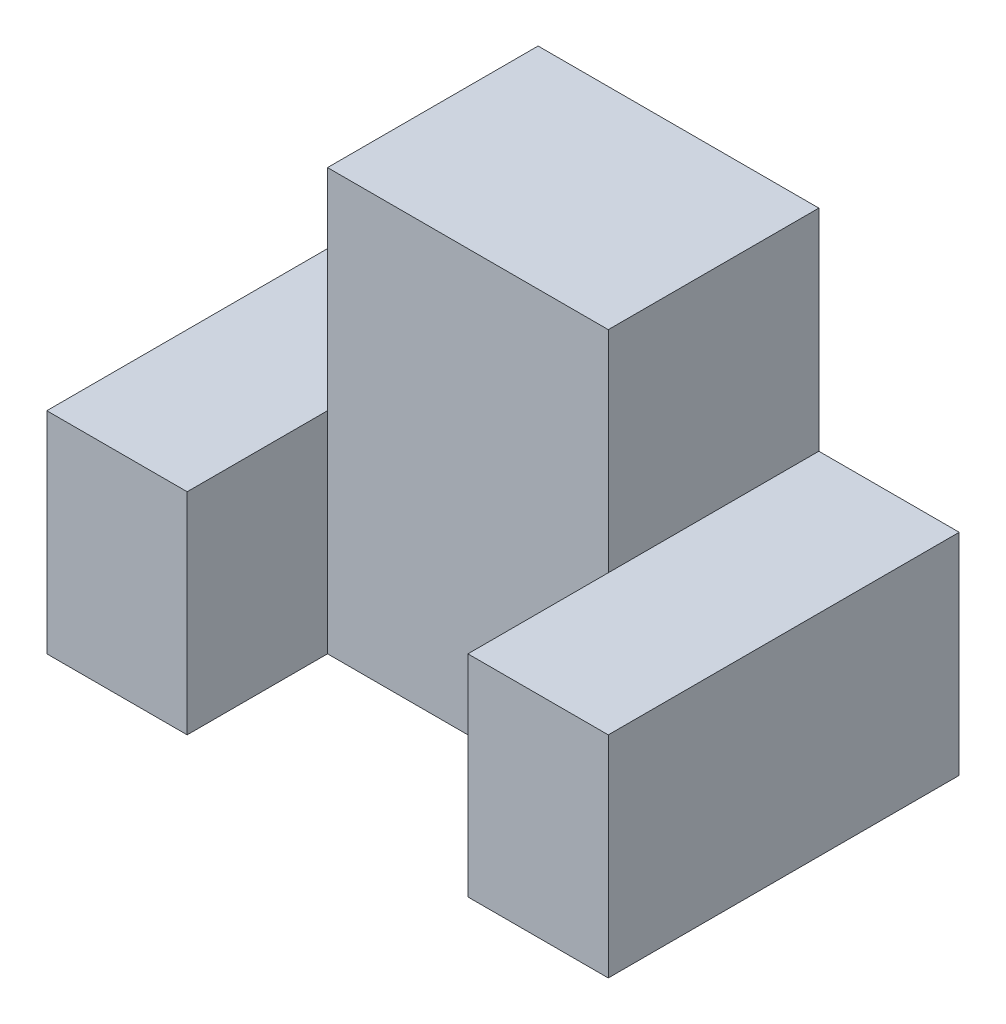
ISO-10303-21;
HEADER;
FILE_DESCRIPTION(('STEP AP214'),'2;1');
FILE_NAME('part.step','',(''),(''),'','','');
FILE_SCHEMA(('AUTOMOTIVE_DESIGN { 1 0 10303 214 1 1 1 1 }'));
ENDSEC;
DATA;
#1=APPLICATION_CONTEXT('core data for automotive mechanical design processes');
#2=APPLICATION_PROTOCOL_DEFINITION('international standard','automotive_design',2000,#1);
#3=PRODUCT_CONTEXT('',#1,'mechanical');
#4=PRODUCT('Part','Part','',(#3));
#5=PRODUCT_RELATED_PRODUCT_CATEGORY('part','',(#4));
#6=PRODUCT_DEFINITION_FORMATION('','',#4);
#7=PRODUCT_DEFINITION_CONTEXT('part definition',#1,'design');
#8=PRODUCT_DEFINITION('design','',#6,#7);
#9=PRODUCT_DEFINITION_SHAPE('','',#8);
#10=(LENGTH_UNIT() NAMED_UNIT(*) SI_UNIT(.MILLI.,.METRE.));
#11=(NAMED_UNIT(*) PLANE_ANGLE_UNIT() SI_UNIT($,.RADIAN.));
#12=(NAMED_UNIT(*) SI_UNIT($,.STERADIAN.) SOLID_ANGLE_UNIT());
#13=UNCERTAINTY_MEASURE_WITH_UNIT(LENGTH_MEASURE(1.E-05),#10,'distance_accuracy_value','');
#14=(GEOMETRIC_REPRESENTATION_CONTEXT(3) GLOBAL_UNCERTAINTY_ASSIGNED_CONTEXT((#13)) GLOBAL_UNIT_ASSIGNED_CONTEXT((#10,
#11,#12)) REPRESENTATION_CONTEXT('',''));
#15=CARTESIAN_POINT('',(0.,0.,0.));
#16=DIRECTION('',(0.,0.,1.));
#17=DIRECTION('',(1.,0.,0.));
#18=AXIS2_PLACEMENT_3D('',#15,#16,#17);
#19=CARTESIAN_POINT('',(-20.,-30.,30.));
#20=DIRECTION('',(1.,0.,0.));
#21=DIRECTION('',(0.,0.,-1.));
#22=AXIS2_PLACEMENT_3D('',#19,#20,#21);
#23=PLANE('',#22);
#24=DIRECTION('',(0.,0.,-1.));
#25=VECTOR('',#24,1.);
#26=CARTESIAN_POINT('',(-20.,0.,0.));
#27=LINE('',#26,#25);
#28=CARTESIAN_POINT('',(-20.,0.,30.));
#29=VERTEX_POINT('',#28);
#30=CARTESIAN_POINT('',(-20.,0.,0.));
#31=VERTEX_POINT('',#30);
#32=EDGE_CURVE('E11',#29,#31,#27,.T.);
#33=ORIENTED_EDGE('',*,*,#32,.F.);
#34=DIRECTION('',(0.,-1.,0.));
#35=VECTOR('',#34,1.);
#36=CARTESIAN_POINT('',(-20.,-30.,30.));
#37=LINE('',#36,#35);
#38=CARTESIAN_POINT('',(-20.,30.,30.));
#39=VERTEX_POINT('',#38);
#40=EDGE_CURVE('E194',#39,#29,#37,.T.);
#41=ORIENTED_EDGE('',*,*,#40,.F.);
#42=DIRECTION('',(0.,0.,-1.));
#43=VECTOR('',#42,1.);
#44=CARTESIAN_POINT('',(-20.,30.,30.));
#45=LINE('',#44,#43);
#46=CARTESIAN_POINT('',(-20.,30.,0.));
#47=VERTEX_POINT('',#46);
#48=EDGE_CURVE('E198',#39,#47,#45,.T.);
#49=ORIENTED_EDGE('',*,*,#48,.T.);
#50=DIRECTION('',(0.,-1.,0.));
#51=VECTOR('',#50,1.);
#52=CARTESIAN_POINT('',(-20.,-30.,0.));
#53=LINE('',#52,#51);
#54=EDGE_CURVE('E135',#47,#31,#53,.T.);
#55=ORIENTED_EDGE('',*,*,#54,.T.);
#56=EDGE_LOOP('',(#33,#41,#49,#55));
#57=FACE_BOUND('',#56,.T.);
#58=ADVANCED_FACE('F37',(#57),#23,.F.);
#59=CARTESIAN_POINT('',(20.,-30.,30.));
#60=DIRECTION('',(-1.,0.,0.));
#61=DIRECTION('',(0.,0.,1.));
#62=AXIS2_PLACEMENT_3D('',#59,#60,#61);
#63=PLANE('',#62);
#64=DIRECTION('',(0.,0.,1.));
#65=VECTOR('',#64,1.);
#66=CARTESIAN_POINT('',(20.,0.,0.));
#67=LINE('',#66,#65);
#68=CARTESIAN_POINT('',(20.,0.,0.));
#69=VERTEX_POINT('',#68);
#70=CARTESIAN_POINT('',(20.,0.,30.));
#71=VERTEX_POINT('',#70);
#72=EDGE_CURVE('E60',#69,#71,#67,.T.);
#73=ORIENTED_EDGE('',*,*,#72,.F.);
#74=DIRECTION('',(0.,1.,0.));
#75=VECTOR('',#74,1.);
#76=CARTESIAN_POINT('',(20.,-30.,0.));
#77=LINE('',#76,#75);
#78=CARTESIAN_POINT('',(20.,30.,0.));
#79=VERTEX_POINT('',#78);
#80=EDGE_CURVE('E188',#69,#79,#77,.T.);
#81=ORIENTED_EDGE('',*,*,#80,.T.);
#82=DIRECTION('',(0.,0.,-1.));
#83=VECTOR('',#82,1.);
#84=CARTESIAN_POINT('',(20.,30.,30.));
#85=LINE('',#84,#83);
#86=CARTESIAN_POINT('',(20.,30.,30.));
#87=VERTEX_POINT('',#86);
#88=EDGE_CURVE('E41',#87,#79,#85,.T.);
#89=ORIENTED_EDGE('',*,*,#88,.F.);
#90=DIRECTION('',(0.,1.,0.));
#91=VECTOR('',#90,1.);
#92=CARTESIAN_POINT('',(20.,-30.,30.));
#93=LINE('',#92,#91);
#94=EDGE_CURVE('E134',#71,#87,#93,.T.);
#95=ORIENTED_EDGE('',*,*,#94,.F.);
#96=EDGE_LOOP('',(#73,#81,#89,#95));
#97=FACE_BOUND('',#96,.T.);
#98=ADVANCED_FACE('F39',(#97),#63,.F.);
#99=CARTESIAN_POINT('',(-20.,30.,30.));
#100=DIRECTION('',(0.,-1.,0.));
#101=DIRECTION('',(0.,0.,-1.));
#102=AXIS2_PLACEMENT_3D('',#99,#100,#101);
#103=PLANE('',#102);
#104=DIRECTION('',(-1.,0.,0.));
#105=VECTOR('',#104,1.);
#106=CARTESIAN_POINT('',(-20.,30.,0.));
#107=LINE('',#106,#105);
#108=EDGE_CURVE('E200',#79,#47,#107,.T.);
#109=ORIENTED_EDGE('',*,*,#108,.T.);
#110=ORIENTED_EDGE('',*,*,#48,.F.);
#111=DIRECTION('',(-1.,0.,0.));
#112=VECTOR('',#111,1.);
#113=CARTESIAN_POINT('',(-20.,30.,30.));
#114=LINE('',#113,#112);
#115=EDGE_CURVE('E191',#87,#39,#114,.T.);
#116=ORIENTED_EDGE('',*,*,#115,.F.);
#117=ORIENTED_EDGE('',*,*,#88,.T.);
#118=EDGE_LOOP('',(#109,#110,#116,#117));
#119=FACE_BOUND('',#118,.T.);
#120=ADVANCED_FACE('F209',(#119),#103,.F.);
#121=CARTESIAN_POINT('',(-20.,-30.,30.));
#122=DIRECTION('',(0.,1.,0.));
#123=DIRECTION('',(0.,0.,1.));
#124=AXIS2_PLACEMENT_3D('',#121,#122,#123);
#125=PLANE('',#124);
#126=DIRECTION('',(1.,0.,0.));
#127=VECTOR('',#126,1.);
#128=CARTESIAN_POINT('',(-20.,-30.,0.));
#129=LINE('',#128,#127);
#130=CARTESIAN_POINT('',(-40.,-30.,0.));
#131=VERTEX_POINT('',#130);
#132=CARTESIAN_POINT('',(40.,-30.,0.));
#133=VERTEX_POINT('',#132);
#134=EDGE_CURVE('E122',#131,#133,#129,.T.);
#135=ORIENTED_EDGE('',*,*,#134,.T.);
#136=DIRECTION('',(0.,0.,-1.));
#137=VECTOR('',#136,1.);
#138=CARTESIAN_POINT('',(40.,-30.,0.));
#139=LINE('',#138,#137);
#140=CARTESIAN_POINT('',(40.,-30.,50.));
#141=VERTEX_POINT('',#140);
#142=EDGE_CURVE('E172',#141,#133,#139,.T.);
#143=ORIENTED_EDGE('',*,*,#142,.F.);
#144=DIRECTION('',(-1.,0.,0.));
#145=VECTOR('',#144,1.);
#146=CARTESIAN_POINT('',(40.,-30.,50.));
#147=LINE('',#146,#145);
#148=CARTESIAN_POINT('',(20.,-30.,50.));
#149=VERTEX_POINT('',#148);
#150=EDGE_CURVE('E174',#141,#149,#147,.T.);
#151=ORIENTED_EDGE('',*,*,#150,.T.);
#152=DIRECTION('',(0.,0.,-1.));
#153=VECTOR('',#152,1.);
#154=CARTESIAN_POINT('',(20.,-30.,0.));
#155=LINE('',#154,#153);
#156=CARTESIAN_POINT('',(20.,-30.,30.));
#157=VERTEX_POINT('',#156);
#158=EDGE_CURVE('E168',#149,#157,#155,.T.);
#159=ORIENTED_EDGE('',*,*,#158,.T.);
#160=DIRECTION('',(1.,0.,0.));
#161=VECTOR('',#160,1.);
#162=CARTESIAN_POINT('',(-20.,-30.,30.));
#163=LINE('',#162,#161);
#164=CARTESIAN_POINT('',(-20.,-30.,30.));
#165=VERTEX_POINT('',#164);
#166=EDGE_CURVE('E196',#165,#157,#163,.T.);
#167=ORIENTED_EDGE('',*,*,#166,.F.);
#168=DIRECTION('',(0.,0.,1.));
#169=VECTOR('',#168,1.);
#170=CARTESIAN_POINT('',(-20.,-30.,0.));
#171=LINE('',#170,#169);
#172=CARTESIAN_POINT('',(-20.,-30.,50.));
#173=VERTEX_POINT('',#172);
#174=EDGE_CURVE('E157',#165,#173,#171,.T.);
#175=ORIENTED_EDGE('',*,*,#174,.T.);
#176=DIRECTION('',(1.,0.,0.));
#177=VECTOR('',#176,1.);
#178=CARTESIAN_POINT('',(-40.,-30.,50.));
#179=LINE('',#178,#177);
#180=CARTESIAN_POINT('',(-40.,-30.,50.));
#181=VERTEX_POINT('',#180);
#182=EDGE_CURVE('E141',#181,#173,#179,.T.);
#183=ORIENTED_EDGE('',*,*,#182,.F.);
#184=DIRECTION('',(0.,0.,1.));
#185=VECTOR('',#184,1.);
#186=CARTESIAN_POINT('',(-40.,-30.,0.));
#187=LINE('',#186,#185);
#188=EDGE_CURVE('E138',#131,#181,#187,.T.);
#189=ORIENTED_EDGE('',*,*,#188,.F.);
#190=EDGE_LOOP('',(#135,#143,#151,#159,#167,#175,#183,#189));
#191=FACE_BOUND('',#190,.T.);
#192=ADVANCED_FACE('F139',(#191),#125,.F.);
#193=CARTESIAN_POINT('',(0.,0.,30.));
#194=DIRECTION('',(0.,0.,-1.));
#195=DIRECTION('',(-1.,0.,0.));
#196=AXIS2_PLACEMENT_3D('',#193,#194,#195);
#197=PLANE('',#196);
#198=EDGE_CURVE('E189',#157,#71,#93,.T.);
#199=ORIENTED_EDGE('',*,*,#198,.T.);
#200=ORIENTED_EDGE('',*,*,#94,.T.);
#201=ORIENTED_EDGE('',*,*,#115,.T.);
#202=ORIENTED_EDGE('',*,*,#40,.T.);
#203=EDGE_CURVE('E193',#29,#165,#37,.T.);
#204=ORIENTED_EDGE('',*,*,#203,.T.);
#205=ORIENTED_EDGE('',*,*,#166,.T.);
#206=EDGE_LOOP('',(#199,#200,#201,#202,#204,#205));
#207=FACE_BOUND('',#206,.T.);
#208=ADVANCED_FACE('F223',(#207),#197,.F.);
#209=CARTESIAN_POINT('',(0.,0.,0.));
#210=DIRECTION('',(0.,0.,-1.));
#211=DIRECTION('',(-1.,0.,0.));
#212=AXIS2_PLACEMENT_3D('',#209,#210,#211);
#213=PLANE('',#212);
#214=ORIENTED_EDGE('',*,*,#80,.F.);
#215=DIRECTION('',(-1.,0.,0.));
#216=VECTOR('',#215,1.);
#217=CARTESIAN_POINT('',(40.,0.,0.));
#218=LINE('',#217,#216);
#219=CARTESIAN_POINT('',(40.,0.,0.));
#220=VERTEX_POINT('',#219);
#221=EDGE_CURVE('E185',#220,#69,#218,.T.);
#222=ORIENTED_EDGE('',*,*,#221,.F.);
#223=DIRECTION('',(0.,1.,0.));
#224=VECTOR('',#223,1.);
#225=CARTESIAN_POINT('',(40.,-30.,0.));
#226=LINE('',#225,#224);
#227=EDGE_CURVE('E130',#133,#220,#226,.T.);
#228=ORIENTED_EDGE('',*,*,#227,.F.);
#229=ORIENTED_EDGE('',*,*,#134,.F.);
#230=DIRECTION('',(0.,-1.,0.));
#231=VECTOR('',#230,1.);
#232=CARTESIAN_POINT('',(-40.,-30.,0.));
#233=LINE('',#232,#231);
#234=CARTESIAN_POINT('',(-40.,0.,0.));
#235=VERTEX_POINT('',#234);
#236=EDGE_CURVE('E127',#235,#131,#233,.T.);
#237=ORIENTED_EDGE('',*,*,#236,.F.);
#238=DIRECTION('',(1.,0.,0.));
#239=VECTOR('',#238,1.);
#240=CARTESIAN_POINT('',(-40.,0.,0.));
#241=LINE('',#240,#239);
#242=EDGE_CURVE('E156',#235,#31,#241,.T.);
#243=ORIENTED_EDGE('',*,*,#242,.T.);
#244=ORIENTED_EDGE('',*,*,#54,.F.);
#245=ORIENTED_EDGE('',*,*,#108,.F.);
#246=EDGE_LOOP('',(#214,#222,#228,#229,#237,#243,#244,#245));
#247=FACE_BOUND('',#246,.T.);
#248=ADVANCED_FACE('F124',(#247),#213,.T.);
#249=CARTESIAN_POINT('',(40.,0.,0.));
#250=DIRECTION('',(0.,-1.,0.));
#251=DIRECTION('',(0.,0.,-1.));
#252=AXIS2_PLACEMENT_3D('',#249,#250,#251);
#253=PLANE('',#252);
#254=ORIENTED_EDGE('',*,*,#72,.T.);
#255=CARTESIAN_POINT('',(20.,0.,50.));
#256=VERTEX_POINT('',#255);
#257=EDGE_CURVE('E165',#71,#256,#67,.T.);
#258=ORIENTED_EDGE('',*,*,#257,.T.);
#259=DIRECTION('',(-1.,0.,0.));
#260=VECTOR('',#259,1.);
#261=CARTESIAN_POINT('',(40.,0.,50.));
#262=LINE('',#261,#260);
#263=CARTESIAN_POINT('',(40.,0.,50.));
#264=VERTEX_POINT('',#263);
#265=EDGE_CURVE('E182',#264,#256,#262,.T.);
#266=ORIENTED_EDGE('',*,*,#265,.F.);
#267=DIRECTION('',(0.,0.,1.));
#268=VECTOR('',#267,1.);
#269=CARTESIAN_POINT('',(40.,0.,0.));
#270=LINE('',#269,#268);
#271=EDGE_CURVE('E167',#220,#264,#270,.T.);
#272=ORIENTED_EDGE('',*,*,#271,.F.);
#273=ORIENTED_EDGE('',*,*,#221,.T.);
#274=EDGE_LOOP('',(#254,#258,#266,#272,#273));
#275=FACE_BOUND('',#274,.T.);
#276=ADVANCED_FACE('F232',(#275),#253,.F.);
#277=CARTESIAN_POINT('',(40.,-30.,50.));
#278=DIRECTION('',(0.,0.,-1.));
#279=DIRECTION('',(-1.,0.,0.));
#280=AXIS2_PLACEMENT_3D('',#277,#278,#279);
#281=PLANE('',#280);
#282=DIRECTION('',(0.,-1.,0.));
#283=VECTOR('',#282,1.);
#284=CARTESIAN_POINT('',(20.,-30.,50.));
#285=LINE('',#284,#283);
#286=EDGE_CURVE('E176',#256,#149,#285,.T.);
#287=ORIENTED_EDGE('',*,*,#286,.T.);
#288=ORIENTED_EDGE('',*,*,#150,.F.);
#289=DIRECTION('',(0.,-1.,0.));
#290=VECTOR('',#289,1.);
#291=CARTESIAN_POINT('',(40.,-30.,50.));
#292=LINE('',#291,#290);
#293=EDGE_CURVE('E170',#264,#141,#292,.T.);
#294=ORIENTED_EDGE('',*,*,#293,.F.);
#295=ORIENTED_EDGE('',*,*,#265,.T.);
#296=EDGE_LOOP('',(#287,#288,#294,#295));
#297=FACE_BOUND('',#296,.T.);
#298=ADVANCED_FACE('F237',(#297),#281,.F.);
#299=CARTESIAN_POINT('',(40.,0.,0.));
#300=DIRECTION('',(1.,0.,0.));
#301=DIRECTION('',(0.,0.,-1.));
#302=AXIS2_PLACEMENT_3D('',#299,#300,#301);
#303=PLANE('',#302);
#304=ORIENTED_EDGE('',*,*,#227,.T.);
#305=ORIENTED_EDGE('',*,*,#271,.T.);
#306=ORIENTED_EDGE('',*,*,#293,.T.);
#307=ORIENTED_EDGE('',*,*,#142,.T.);
#308=EDGE_LOOP('',(#304,#305,#306,#307));
#309=FACE_BOUND('',#308,.T.);
#310=ADVANCED_FACE('F235',(#309),#303,.T.);
#311=CARTESIAN_POINT('',(20.,0.,0.));
#312=DIRECTION('',(1.,0.,0.));
#313=DIRECTION('',(0.,0.,-1.));
#314=AXIS2_PLACEMENT_3D('',#311,#312,#313);
#315=PLANE('',#314);
#316=ORIENTED_EDGE('',*,*,#198,.F.);
#317=ORIENTED_EDGE('',*,*,#158,.F.);
#318=ORIENTED_EDGE('',*,*,#286,.F.);
#319=ORIENTED_EDGE('',*,*,#257,.F.);
#320=EDGE_LOOP('',(#316,#317,#318,#319));
#321=FACE_BOUND('',#320,.T.);
#322=ADVANCED_FACE('F229',(#321),#315,.F.);
#323=CARTESIAN_POINT('',(-20.,0.,0.));
#324=DIRECTION('',(1.,0.,0.));
#325=DIRECTION('',(0.,0.,-1.));
#326=AXIS2_PLACEMENT_3D('',#323,#324,#325);
#327=PLANE('',#326);
#328=ORIENTED_EDGE('',*,*,#203,.F.);
#329=CARTESIAN_POINT('',(-20.,0.,50.));
#330=VERTEX_POINT('',#329);
#331=EDGE_CURVE('E47',#330,#29,#27,.T.);
#332=ORIENTED_EDGE('',*,*,#331,.F.);
#333=DIRECTION('',(0.,1.,0.));
#334=VECTOR('',#333,1.);
#335=CARTESIAN_POINT('',(-20.,-30.,50.));
#336=LINE('',#335,#334);
#337=EDGE_CURVE('E152',#173,#330,#336,.T.);
#338=ORIENTED_EDGE('',*,*,#337,.F.);
#339=ORIENTED_EDGE('',*,*,#174,.F.);
#340=EDGE_LOOP('',(#328,#332,#338,#339));
#341=FACE_BOUND('',#340,.T.);
#342=ADVANCED_FACE('F219',(#341),#327,.T.);
#343=CARTESIAN_POINT('',(-40.,-30.,50.));
#344=DIRECTION('',(0.,0.,-1.));
#345=DIRECTION('',(-1.,0.,0.));
#346=AXIS2_PLACEMENT_3D('',#343,#344,#345);
#347=PLANE('',#346);
#348=ORIENTED_EDGE('',*,*,#337,.T.);
#349=DIRECTION('',(1.,0.,0.));
#350=VECTOR('',#349,1.);
#351=CARTESIAN_POINT('',(-40.,0.,50.));
#352=LINE('',#351,#350);
#353=CARTESIAN_POINT('',(-40.,0.,50.));
#354=VERTEX_POINT('',#353);
#355=EDGE_CURVE('E161',#354,#330,#352,.T.);
#356=ORIENTED_EDGE('',*,*,#355,.F.);
#357=DIRECTION('',(0.,1.,0.));
#358=VECTOR('',#357,1.);
#359=CARTESIAN_POINT('',(-40.,-30.,50.));
#360=LINE('',#359,#358);
#361=EDGE_CURVE('E144',#181,#354,#360,.T.);
#362=ORIENTED_EDGE('',*,*,#361,.F.);
#363=ORIENTED_EDGE('',*,*,#182,.T.);
#364=EDGE_LOOP('',(#348,#356,#362,#363));
#365=FACE_BOUND('',#364,.T.);
#366=ADVANCED_FACE('F330',(#365),#347,.F.);
#367=CARTESIAN_POINT('',(-40.,0.,0.));
#368=DIRECTION('',(0.,-1.,0.));
#369=DIRECTION('',(0.,0.,-1.));
#370=AXIS2_PLACEMENT_3D('',#367,#368,#369);
#371=PLANE('',#370);
#372=ORIENTED_EDGE('',*,*,#331,.T.);
#373=ORIENTED_EDGE('',*,*,#32,.T.);
#374=ORIENTED_EDGE('',*,*,#242,.F.);
#375=DIRECTION('',(0.,0.,-1.));
#376=VECTOR('',#375,1.);
#377=CARTESIAN_POINT('',(-40.,0.,0.));
#378=LINE('',#377,#376);
#379=EDGE_CURVE('E148',#354,#235,#378,.T.);
#380=ORIENTED_EDGE('',*,*,#379,.F.);
#381=ORIENTED_EDGE('',*,*,#355,.T.);
#382=EDGE_LOOP('',(#372,#373,#374,#380,#381));
#383=FACE_BOUND('',#382,.T.);
#384=ADVANCED_FACE('F213',(#383),#371,.F.);
#385=CARTESIAN_POINT('',(-40.,0.,0.));
#386=DIRECTION('',(1.,0.,0.));
#387=DIRECTION('',(0.,0.,-1.));
#388=AXIS2_PLACEMENT_3D('',#385,#386,#387);
#389=PLANE('',#388);
#390=ORIENTED_EDGE('',*,*,#236,.T.);
#391=ORIENTED_EDGE('',*,*,#188,.T.);
#392=ORIENTED_EDGE('',*,*,#361,.T.);
#393=ORIENTED_EDGE('',*,*,#379,.T.);
#394=EDGE_LOOP('',(#390,#391,#392,#393));
#395=FACE_BOUND('',#394,.T.);
#396=ADVANCED_FACE('F146',(#395),#389,.F.);
#397=CLOSED_SHELL('',(#58,#98,#120,#192,#208,#248,#276,#298,#310,#322,#342,#366,#384,#396));
#398=MANIFOLD_SOLID_BREP('B2',#397);
#399=ADVANCED_BREP_SHAPE_REPRESENTATION('',(#18,#398),#14);
#400=SHAPE_DEFINITION_REPRESENTATION(#9,#399);
ENDSEC;
END-ISO-10303-21;
